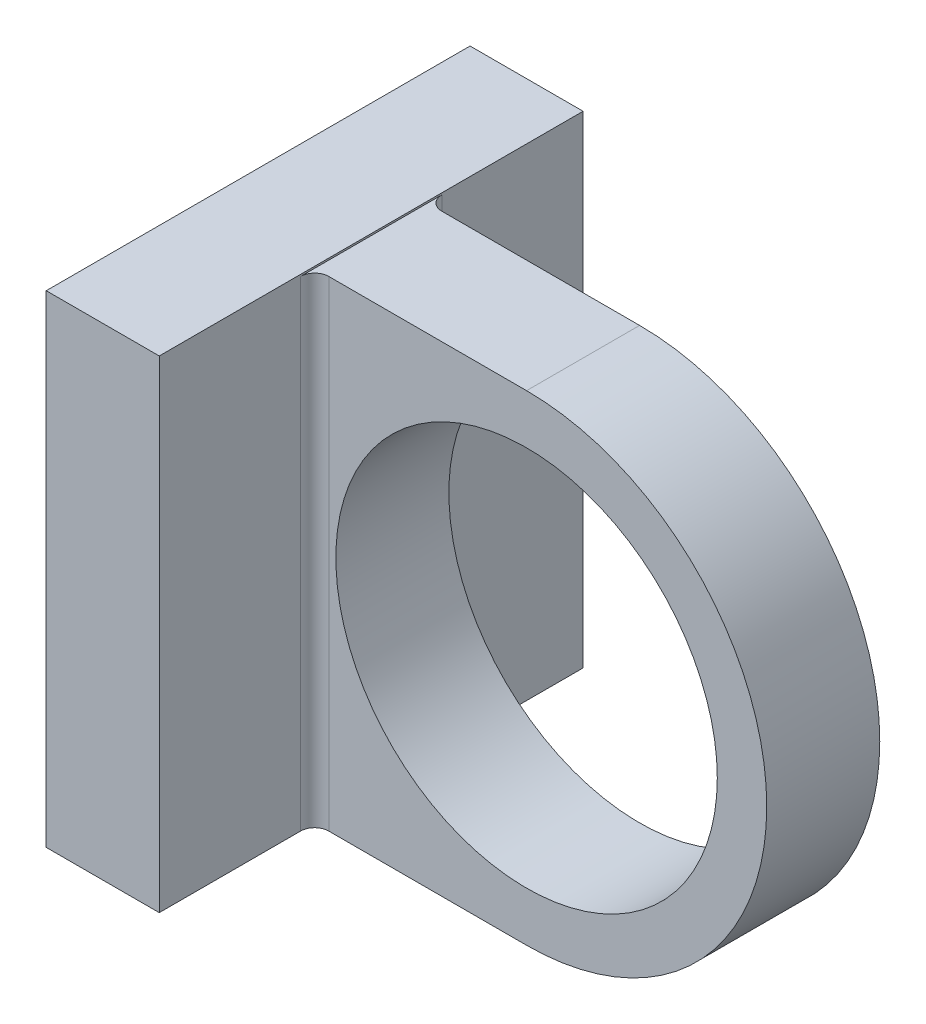
ISO-10303-21;
HEADER;
FILE_DESCRIPTION(('STEP AP214'),'2;1');
FILE_NAME('part.step','',(''),(''),'','','');
FILE_SCHEMA(('AUTOMOTIVE_DESIGN { 1 0 10303 214 1 1 1 1 }'));
ENDSEC;
DATA;
#1=APPLICATION_CONTEXT('core data for automotive mechanical design processes');
#2=APPLICATION_PROTOCOL_DEFINITION('international standard','automotive_design',2000,#1);
#3=PRODUCT_CONTEXT('',#1,'mechanical');
#4=PRODUCT('Part','Part','',(#3));
#5=PRODUCT_RELATED_PRODUCT_CATEGORY('part','',(#4));
#6=PRODUCT_DEFINITION_FORMATION('','',#4);
#7=PRODUCT_DEFINITION_CONTEXT('part definition',#1,'design');
#8=PRODUCT_DEFINITION('design','',#6,#7);
#9=PRODUCT_DEFINITION_SHAPE('','',#8);
#10=(LENGTH_UNIT() NAMED_UNIT(*) SI_UNIT(.MILLI.,.METRE.));
#11=(NAMED_UNIT(*) PLANE_ANGLE_UNIT() SI_UNIT($,.RADIAN.));
#12=(NAMED_UNIT(*) SI_UNIT($,.STERADIAN.) SOLID_ANGLE_UNIT());
#13=UNCERTAINTY_MEASURE_WITH_UNIT(LENGTH_MEASURE(1.E-05),#10,'distance_accuracy_value','');
#14=(GEOMETRIC_REPRESENTATION_CONTEXT(3) GLOBAL_UNCERTAINTY_ASSIGNED_CONTEXT((#13)) GLOBAL_UNIT_ASSIGNED_CONTEXT((#10,
#11,#12)) REPRESENTATION_CONTEXT('',''));
#15=CARTESIAN_POINT('',(0.,0.,0.));
#16=DIRECTION('',(0.,0.,1.));
#17=DIRECTION('',(1.,0.,0.));
#18=AXIS2_PLACEMENT_3D('',#15,#16,#17);
#19=CARTESIAN_POINT('',(22.9128784747792,-0.887716477004379,8.));
#20=DIRECTION('',(0.,0.,1.));
#21=DIRECTION('',(1.,0.,0.));
#22=AXIS2_PLACEMENT_3D('',#19,#20,#21);
#23=PLANE('',#22);
#24=CARTESIAN_POINT('',(22.9128784747792,-0.887716477004379,8.));
#25=DIRECTION('',(0.,0.,1.));
#26=DIRECTION('',(1.,0.,0.));
#27=AXIS2_PLACEMENT_3D('',#24,#25,#26);
#28=CIRCLE('',#27,13.5);
#29=CARTESIAN_POINT('',(36.4128784747792,-0.887716477004379,8.));
#30=VERTEX_POINT('',#29);
#31=EDGE_CURVE('E175',#30,#30,#28,.T.);
#32=ORIENTED_EDGE('',*,*,#31,.F.);
#33=EDGE_LOOP('',(#32));
#34=FACE_BOUND('',#33,.T.);
#35=DIRECTION('',(-1.,0.,0.));
#36=VECTOR('',#35,1.);
#37=CARTESIAN_POINT('',(22.9128784747792,16.1122835229956,8.));
#38=LINE('',#37,#36);
#39=CARTESIAN_POINT('',(22.9128784747792,16.1122835229956,8.));
#40=VERTEX_POINT('',#39);
#41=CARTESIAN_POINT('',(8.9128784747792,16.1122835229956,8.));
#42=VERTEX_POINT('',#41);
#43=EDGE_CURVE('E187',#40,#42,#38,.T.);
#44=ORIENTED_EDGE('',*,*,#43,.T.);
#45=DIRECTION('',(0.,-1.,0.));
#46=VECTOR('',#45,1.);
#47=CARTESIAN_POINT('',(8.91287847477921,-0.887716477004382,8.));
#48=LINE('',#47,#46);
#49=CARTESIAN_POINT('',(8.91287847477921,-17.8877164770044,8.));
#50=VERTEX_POINT('',#49);
#51=EDGE_CURVE('E222',#42,#50,#48,.T.);
#52=ORIENTED_EDGE('',*,*,#51,.T.);
#53=DIRECTION('',(1.,0.,0.));
#54=VECTOR('',#53,1.);
#55=CARTESIAN_POINT('',(22.9128784747792,-17.8877164770044,8.));
#56=LINE('',#55,#54);
#57=CARTESIAN_POINT('',(22.9128784747792,-17.8877164770044,8.));
#58=VERTEX_POINT('',#57);
#59=EDGE_CURVE('E191',#50,#58,#56,.T.);
#60=ORIENTED_EDGE('',*,*,#59,.T.);
#61=CARTESIAN_POINT('',(22.9128784747792,-0.887716477004379,8.));
#62=DIRECTION('',(0.,0.,1.));
#63=DIRECTION('',(1.,0.,0.));
#64=AXIS2_PLACEMENT_3D('',#61,#62,#63);
#65=CIRCLE('',#64,17.);
#66=EDGE_CURVE('E183',#58,#40,#65,.T.);
#67=ORIENTED_EDGE('',*,*,#66,.T.);
#68=EDGE_LOOP('',(#44,#52,#60,#67));
#69=FACE_BOUND('',#68,.T.);
#70=ADVANCED_FACE('F39',(#34,#69),#23,.T.);
#71=CARTESIAN_POINT('',(22.9128784747792,-0.887716477004379,0.));
#72=DIRECTION('',(0.,0.,1.));
#73=DIRECTION('',(1.,0.,0.));
#74=AXIS2_PLACEMENT_3D('',#71,#72,#73);
#75=PLANE('',#74);
#76=CARTESIAN_POINT('',(22.9128784747792,-0.887716477004379,0.));
#77=DIRECTION('',(0.,0.,1.));
#78=DIRECTION('',(1.,0.,0.));
#79=AXIS2_PLACEMENT_3D('',#76,#77,#78);
#80=CIRCLE('',#79,13.5);
#81=CARTESIAN_POINT('',(36.4128784747792,-0.887716477004379,0.));
#82=VERTEX_POINT('',#81);
#83=EDGE_CURVE('E174',#82,#82,#80,.T.);
#84=ORIENTED_EDGE('',*,*,#83,.T.);
#85=EDGE_LOOP('',(#84));
#86=FACE_BOUND('',#85,.T.);
#87=DIRECTION('',(1.,0.,0.));
#88=VECTOR('',#87,1.);
#89=CARTESIAN_POINT('',(22.9128784747792,-17.8877164770044,0.));
#90=LINE('',#89,#88);
#91=CARTESIAN_POINT('',(8.91287847477921,-17.8877164770044,0.));
#92=VERTEX_POINT('',#91);
#93=CARTESIAN_POINT('',(22.9128784747792,-17.8877164770044,0.));
#94=VERTEX_POINT('',#93);
#95=EDGE_CURVE('E188',#92,#94,#90,.T.);
#96=ORIENTED_EDGE('',*,*,#95,.F.);
#97=DIRECTION('',(0.,-1.,0.));
#98=VECTOR('',#97,1.);
#99=CARTESIAN_POINT('',(8.9128784747792,16.1122835229956,0.));
#100=LINE('',#99,#98);
#101=CARTESIAN_POINT('',(8.9128784747792,16.1122835229956,0.));
#102=VERTEX_POINT('',#101);
#103=EDGE_CURVE('E219',#92,#102,#100,.F.);
#104=ORIENTED_EDGE('',*,*,#103,.T.);
#105=DIRECTION('',(-1.,0.,0.));
#106=VECTOR('',#105,1.);
#107=CARTESIAN_POINT('',(22.9128784747792,16.1122835229956,0.));
#108=LINE('',#107,#106);
#109=CARTESIAN_POINT('',(22.9128784747792,16.1122835229956,0.));
#110=VERTEX_POINT('',#109);
#111=EDGE_CURVE('E198',#110,#102,#108,.T.);
#112=ORIENTED_EDGE('',*,*,#111,.F.);
#113=CARTESIAN_POINT('',(22.9128784747792,-0.887716477004379,0.));
#114=DIRECTION('',(0.,0.,1.));
#115=DIRECTION('',(1.,0.,0.));
#116=AXIS2_PLACEMENT_3D('',#113,#114,#115);
#117=CIRCLE('',#116,17.);
#118=EDGE_CURVE('E179',#94,#110,#117,.T.);
#119=ORIENTED_EDGE('',*,*,#118,.F.);
#120=EDGE_LOOP('',(#96,#104,#112,#119));
#121=FACE_BOUND('',#120,.T.);
#122=ADVANCED_FACE('F247',(#86,#121),#75,.F.);
#123=CARTESIAN_POINT('',(22.9128784747792,16.1122835229956,8.));
#124=DIRECTION('',(0.,-1.,0.));
#125=DIRECTION('',(0.,0.,-1.));
#126=AXIS2_PLACEMENT_3D('',#123,#124,#125);
#127=PLANE('',#126);
#128=DIRECTION('',(0.,0.,-1.));
#129=VECTOR('',#128,1.);
#130=CARTESIAN_POINT('',(7.9128784747792,16.1122835229956,8.));
#131=LINE('',#130,#129);
#132=CARTESIAN_POINT('',(7.9128784747792,16.1122835229956,9.));
#133=VERTEX_POINT('',#132);
#134=CARTESIAN_POINT('',(7.9128784747792,16.1122835229956,-1.));
#135=VERTEX_POINT('',#134);
#136=EDGE_CURVE('E166',#133,#135,#131,.T.);
#137=ORIENTED_EDGE('',*,*,#136,.F.);
#138=CARTESIAN_POINT('',(8.9128784747792,16.1122835229956,9.));
#139=DIRECTION('',(0.,-1.,0.));
#140=DIRECTION('',(0.,0.,-1.));
#141=AXIS2_PLACEMENT_3D('',#138,#139,#140);
#142=CIRCLE('',#141,1.);
#143=EDGE_CURVE('E11',#133,#42,#142,.T.);
#144=ORIENTED_EDGE('',*,*,#143,.T.);
#145=ORIENTED_EDGE('',*,*,#43,.F.);
#146=DIRECTION('',(0.,0.,-1.));
#147=VECTOR('',#146,1.);
#148=CARTESIAN_POINT('',(22.9128784747792,16.1122835229956,8.));
#149=LINE('',#148,#147);
#150=EDGE_CURVE('E209',#40,#110,#149,.T.);
#151=ORIENTED_EDGE('',*,*,#150,.T.);
#152=ORIENTED_EDGE('',*,*,#111,.T.);
#153=CARTESIAN_POINT('',(8.9128784747792,16.1122835229956,-1.));
#154=DIRECTION('',(0.,-1.,0.));
#155=DIRECTION('',(0.,0.,-1.));
#156=AXIS2_PLACEMENT_3D('',#153,#154,#155);
#157=CIRCLE('',#156,1.);
#158=EDGE_CURVE('E228',#102,#135,#157,.T.);
#159=ORIENTED_EDGE('',*,*,#158,.T.);
#160=EDGE_LOOP('',(#137,#144,#145,#151,#152,#159));
#161=FACE_BOUND('',#160,.T.);
#162=ADVANCED_FACE('F240',(#161),#127,.F.);
#163=CARTESIAN_POINT('',(22.9128784747792,-0.887716477004379,8.));
#164=DIRECTION('',(0.,0.,-1.));
#165=DIRECTION('',(-1.,0.,0.));
#166=AXIS2_PLACEMENT_3D('',#163,#164,#165);
#167=CYLINDRICAL_SURFACE('',#166,17.);
#168=ORIENTED_EDGE('',*,*,#118,.T.);
#169=ORIENTED_EDGE('',*,*,#150,.F.);
#170=ORIENTED_EDGE('',*,*,#66,.F.);
#171=DIRECTION('',(0.,0.,-1.));
#172=VECTOR('',#171,1.);
#173=CARTESIAN_POINT('',(22.9128784747792,-17.8877164770044,8.));
#174=LINE('',#173,#172);
#175=EDGE_CURVE('E194',#58,#94,#174,.T.);
#176=ORIENTED_EDGE('',*,*,#175,.T.);
#177=EDGE_LOOP('',(#168,#169,#170,#176));
#178=FACE_BOUND('',#177,.T.);
#179=ADVANCED_FACE('F244',(#178),#167,.T.);
#180=CARTESIAN_POINT('',(-0.0871215252207999,16.1122835229956,8.));
#181=DIRECTION('',(1.,0.,0.));
#182=DIRECTION('',(0.,1.,0.));
#183=AXIS2_PLACEMENT_3D('',#180,#181,#182);
#184=PLANE('',#183);
#185=DIRECTION('',(0.,0.,-1.));
#186=VECTOR('',#185,1.);
#187=CARTESIAN_POINT('',(-0.087121525220793,-17.8877164770044,8.));
#188=LINE('',#187,#186);
#189=CARTESIAN_POINT('',(-0.087121525220793,-17.8877164770044,19.));
#190=VERTEX_POINT('',#189);
#191=CARTESIAN_POINT('',(-0.087121525220793,-17.8877164770044,-11.));
#192=VERTEX_POINT('',#191);
#193=EDGE_CURVE('E120',#190,#192,#188,.T.);
#194=ORIENTED_EDGE('',*,*,#193,.F.);
#195=DIRECTION('',(0.,1.,0.));
#196=VECTOR('',#195,1.);
#197=CARTESIAN_POINT('',(-0.0871215252207999,16.2391939796381,19.));
#198=LINE('',#197,#196);
#199=CARTESIAN_POINT('',(-0.0871215252207999,16.2391939796381,19.));
#200=VERTEX_POINT('',#199);
#201=EDGE_CURVE('E150',#190,#200,#198,.T.);
#202=ORIENTED_EDGE('',*,*,#201,.T.);
#203=DIRECTION('',(0.,0.,-1.));
#204=VECTOR('',#203,1.);
#205=CARTESIAN_POINT('',(-0.0871215252207999,16.2391939796381,-11.));
#206=LINE('',#205,#204);
#207=CARTESIAN_POINT('',(-0.0871215252207999,16.2391939796381,-11.));
#208=VERTEX_POINT('',#207);
#209=EDGE_CURVE('E145',#200,#208,#206,.T.);
#210=ORIENTED_EDGE('',*,*,#209,.T.);
#211=DIRECTION('',(0.,-1.,0.));
#212=VECTOR('',#211,1.);
#213=CARTESIAN_POINT('',(-0.0871215252207999,16.2391939796381,-11.));
#214=LINE('',#213,#212);
#215=EDGE_CURVE('E158',#208,#192,#214,.T.);
#216=ORIENTED_EDGE('',*,*,#215,.T.);
#217=EDGE_LOOP('',(#194,#202,#210,#216));
#218=FACE_BOUND('',#217,.T.);
#219=ADVANCED_FACE('F274',(#218),#184,.F.);
#220=CARTESIAN_POINT('',(22.9128784747792,-17.8877164770044,8.));
#221=DIRECTION('',(0.,1.,0.));
#222=DIRECTION('',(-1.,0.,0.));
#223=AXIS2_PLACEMENT_3D('',#220,#221,#222);
#224=PLANE('',#223);
#225=ORIENTED_EDGE('',*,*,#193,.T.);
#226=DIRECTION('',(-1.,0.,0.));
#227=VECTOR('',#226,1.);
#228=CARTESIAN_POINT('',(7.91287847477921,-17.8877164770044,-11.));
#229=LINE('',#228,#227);
#230=CARTESIAN_POINT('',(7.91287847477921,-17.8877164770044,-11.));
#231=VERTEX_POINT('',#230);
#232=EDGE_CURVE('E115',#231,#192,#229,.T.);
#233=ORIENTED_EDGE('',*,*,#232,.F.);
#234=DIRECTION('',(0.,0.,1.));
#235=VECTOR('',#234,1.);
#236=CARTESIAN_POINT('',(7.91287847477921,-17.8877164770044,-11.));
#237=LINE('',#236,#235);
#238=CARTESIAN_POINT('',(7.91287847477921,-17.8877164770044,-1.));
#239=VERTEX_POINT('',#238);
#240=EDGE_CURVE('E118',#231,#239,#237,.T.);
#241=ORIENTED_EDGE('',*,*,#240,.T.);
#242=CARTESIAN_POINT('',(8.91287847477921,-17.8877164770044,-1.));
#243=DIRECTION('',(0.,1.,0.));
#244=DIRECTION('',(-1.,0.,0.));
#245=AXIS2_PLACEMENT_3D('',#242,#243,#244);
#246=CIRCLE('',#245,1.);
#247=EDGE_CURVE('E225',#239,#92,#246,.T.);
#248=ORIENTED_EDGE('',*,*,#247,.T.);
#249=ORIENTED_EDGE('',*,*,#95,.T.);
#250=ORIENTED_EDGE('',*,*,#175,.F.);
#251=ORIENTED_EDGE('',*,*,#59,.F.);
#252=CARTESIAN_POINT('',(8.91287847477921,-17.8877164770044,9.));
#253=DIRECTION('',(0.,1.,0.));
#254=DIRECTION('',(-1.,0.,0.));
#255=AXIS2_PLACEMENT_3D('',#252,#253,#254);
#256=CIRCLE('',#255,1.);
#257=CARTESIAN_POINT('',(7.91287847477921,-17.8877164770044,9.));
#258=VERTEX_POINT('',#257);
#259=EDGE_CURVE('E48',#50,#258,#256,.T.);
#260=ORIENTED_EDGE('',*,*,#259,.T.);
#261=CARTESIAN_POINT('',(7.91287847477921,-17.8877164770044,19.));
#262=VERTEX_POINT('',#261);
#263=EDGE_CURVE('E140',#258,#262,#237,.T.);
#264=ORIENTED_EDGE('',*,*,#263,.T.);
#265=DIRECTION('',(-1.,0.,0.));
#266=VECTOR('',#265,1.);
#267=CARTESIAN_POINT('',(7.91287847477921,-17.8877164770044,19.));
#268=LINE('',#267,#266);
#269=EDGE_CURVE('E126',#262,#190,#268,.T.);
#270=ORIENTED_EDGE('',*,*,#269,.T.);
#271=EDGE_LOOP('',(#225,#233,#241,#248,#249,#250,#251,#260,#264,#270));
#272=FACE_BOUND('',#271,.T.);
#273=ADVANCED_FACE('F117',(#272),#224,.F.);
#274=CARTESIAN_POINT('',(22.9128784747792,-0.887716477004379,8.));
#275=DIRECTION('',(0.,0.,-1.));
#276=DIRECTION('',(-1.,0.,0.));
#277=AXIS2_PLACEMENT_3D('',#274,#275,#276);
#278=CYLINDRICAL_SURFACE('',#277,13.5);
#279=ORIENTED_EDGE('',*,*,#31,.T.);
#280=EDGE_LOOP('',(#279));
#281=FACE_BOUND('',#280,.T.);
#282=ORIENTED_EDGE('',*,*,#83,.F.);
#283=EDGE_LOOP('',(#282));
#284=FACE_BOUND('',#283,.T.);
#285=ADVANCED_FACE('F269',(#281,#284),#278,.F.);
#286=CARTESIAN_POINT('',(7.9128784747792,16.2391939796381,-11.));
#287=DIRECTION('',(0.,0.,-1.));
#288=DIRECTION('',(0.,1.,0.));
#289=AXIS2_PLACEMENT_3D('',#286,#287,#288);
#290=PLANE('',#289);
#291=ORIENTED_EDGE('',*,*,#215,.F.);
#292=DIRECTION('',(-1.,0.,0.));
#293=VECTOR('',#292,1.);
#294=CARTESIAN_POINT('',(7.9128784747792,16.2391939796381,-11.));
#295=LINE('',#294,#293);
#296=CARTESIAN_POINT('',(7.9128784747792,16.2391939796381,-11.));
#297=VERTEX_POINT('',#296);
#298=EDGE_CURVE('E143',#297,#208,#295,.T.);
#299=ORIENTED_EDGE('',*,*,#298,.F.);
#300=DIRECTION('',(0.,-1.,0.));
#301=VECTOR('',#300,1.);
#302=CARTESIAN_POINT('',(7.9128784747792,16.2391939796381,-11.));
#303=LINE('',#302,#301);
#304=EDGE_CURVE('E134',#297,#231,#303,.T.);
#305=ORIENTED_EDGE('',*,*,#304,.T.);
#306=ORIENTED_EDGE('',*,*,#232,.T.);
#307=EDGE_LOOP('',(#291,#299,#305,#306));
#308=FACE_BOUND('',#307,.T.);
#309=ADVANCED_FACE('F142',(#308),#290,.T.);
#310=CARTESIAN_POINT('',(7.9128784747792,16.2391939796381,-11.));
#311=DIRECTION('',(0.,1.,0.));
#312=DIRECTION('',(0.,0.,1.));
#313=AXIS2_PLACEMENT_3D('',#310,#311,#312);
#314=PLANE('',#313);
#315=ORIENTED_EDGE('',*,*,#209,.F.);
#316=DIRECTION('',(-1.,0.,0.));
#317=VECTOR('',#316,1.);
#318=CARTESIAN_POINT('',(7.9128784747792,16.2391939796381,19.));
#319=LINE('',#318,#317);
#320=CARTESIAN_POINT('',(7.9128784747792,16.2391939796381,19.));
#321=VERTEX_POINT('',#320);
#322=EDGE_CURVE('E167',#321,#200,#319,.T.);
#323=ORIENTED_EDGE('',*,*,#322,.F.);
#324=DIRECTION('',(0.,0.,-1.));
#325=VECTOR('',#324,1.);
#326=CARTESIAN_POINT('',(7.9128784747792,16.2391939796381,-11.));
#327=LINE('',#326,#325);
#328=EDGE_CURVE('E127',#321,#297,#327,.T.);
#329=ORIENTED_EDGE('',*,*,#328,.T.);
#330=ORIENTED_EDGE('',*,*,#298,.T.);
#331=EDGE_LOOP('',(#315,#323,#329,#330));
#332=FACE_BOUND('',#331,.T.);
#333=ADVANCED_FACE('F305',(#332),#314,.T.);
#334=CARTESIAN_POINT('',(7.9128784747792,16.2391939796381,19.));
#335=DIRECTION('',(0.,0.,1.));
#336=DIRECTION('',(0.,-1.,0.));
#337=AXIS2_PLACEMENT_3D('',#334,#335,#336);
#338=PLANE('',#337);
#339=ORIENTED_EDGE('',*,*,#201,.F.);
#340=ORIENTED_EDGE('',*,*,#269,.F.);
#341=DIRECTION('',(0.,1.,0.));
#342=VECTOR('',#341,1.);
#343=CARTESIAN_POINT('',(7.9128784747792,16.2391939796381,19.));
#344=LINE('',#343,#342);
#345=EDGE_CURVE('E139',#262,#321,#344,.T.);
#346=ORIENTED_EDGE('',*,*,#345,.T.);
#347=ORIENTED_EDGE('',*,*,#322,.T.);
#348=EDGE_LOOP('',(#339,#340,#346,#347));
#349=FACE_BOUND('',#348,.T.);
#350=ADVANCED_FACE('F256',(#349),#338,.T.);
#351=CARTESIAN_POINT('',(7.9128784747792,0.,0.));
#352=DIRECTION('',(-1.,0.,0.));
#353=DIRECTION('',(0.,-1.,0.));
#354=AXIS2_PLACEMENT_3D('',#351,#352,#353);
#355=PLANE('',#354);
#356=ORIENTED_EDGE('',*,*,#136,.T.);
#357=DIRECTION('',(0.,-1.,0.));
#358=VECTOR('',#357,1.);
#359=CARTESIAN_POINT('',(7.91287847477921,-17.8877164770044,-1.));
#360=LINE('',#359,#358);
#361=EDGE_CURVE('E137',#135,#239,#360,.T.);
#362=ORIENTED_EDGE('',*,*,#361,.T.);
#363=ORIENTED_EDGE('',*,*,#240,.F.);
#364=ORIENTED_EDGE('',*,*,#304,.F.);
#365=ORIENTED_EDGE('',*,*,#328,.F.);
#366=ORIENTED_EDGE('',*,*,#345,.F.);
#367=ORIENTED_EDGE('',*,*,#263,.F.);
#368=DIRECTION('',(0.,-1.,0.));
#369=VECTOR('',#368,1.);
#370=CARTESIAN_POINT('',(7.9128784747792,0.,9.));
#371=LINE('',#370,#369);
#372=EDGE_CURVE('E213',#258,#133,#371,.F.);
#373=ORIENTED_EDGE('',*,*,#372,.T.);
#374=EDGE_LOOP('',(#356,#362,#363,#364,#365,#366,#367,#373));
#375=FACE_BOUND('',#374,.T.);
#376=ADVANCED_FACE('F132',(#375),#355,.F.);
#377=CARTESIAN_POINT('',(8.91287847477921,0.,-1.));
#378=DIRECTION('',(0.,1.,0.));
#379=DIRECTION('',(-1.,0.,0.));
#380=AXIS2_PLACEMENT_3D('',#377,#378,#379);
#381=CYLINDRICAL_SURFACE('',#380,1.);
#382=ORIENTED_EDGE('',*,*,#158,.F.);
#383=ORIENTED_EDGE('',*,*,#103,.F.);
#384=ORIENTED_EDGE('',*,*,#247,.F.);
#385=ORIENTED_EDGE('',*,*,#361,.F.);
#386=EDGE_LOOP('',(#382,#383,#384,#385));
#387=FACE_BOUND('',#386,.T.);
#388=ADVANCED_FACE('F250',(#387),#381,.F.);
#389=CARTESIAN_POINT('',(8.91287847477921,-0.887716477004382,9.));
#390=DIRECTION('',(0.,-1.,0.));
#391=DIRECTION('',(1.,0.,0.));
#392=AXIS2_PLACEMENT_3D('',#389,#390,#391);
#393=CYLINDRICAL_SURFACE('',#392,1.);
#394=ORIENTED_EDGE('',*,*,#143,.F.);
#395=ORIENTED_EDGE('',*,*,#372,.F.);
#396=ORIENTED_EDGE('',*,*,#259,.F.);
#397=ORIENTED_EDGE('',*,*,#51,.F.);
#398=EDGE_LOOP('',(#394,#395,#396,#397));
#399=FACE_BOUND('',#398,.T.);
#400=ADVANCED_FACE('F41',(#399),#393,.F.);
#401=CLOSED_SHELL('',(#70,#122,#162,#179,#219,#273,#285,#309,#333,#350,#376,#388,#400));
#402=MANIFOLD_SOLID_BREP('B2',#401);
#403=ADVANCED_BREP_SHAPE_REPRESENTATION('',(#18,#402),#14);
#404=SHAPE_DEFINITION_REPRESENTATION(#9,#403);
ENDSEC;
END-ISO-10303-21;
